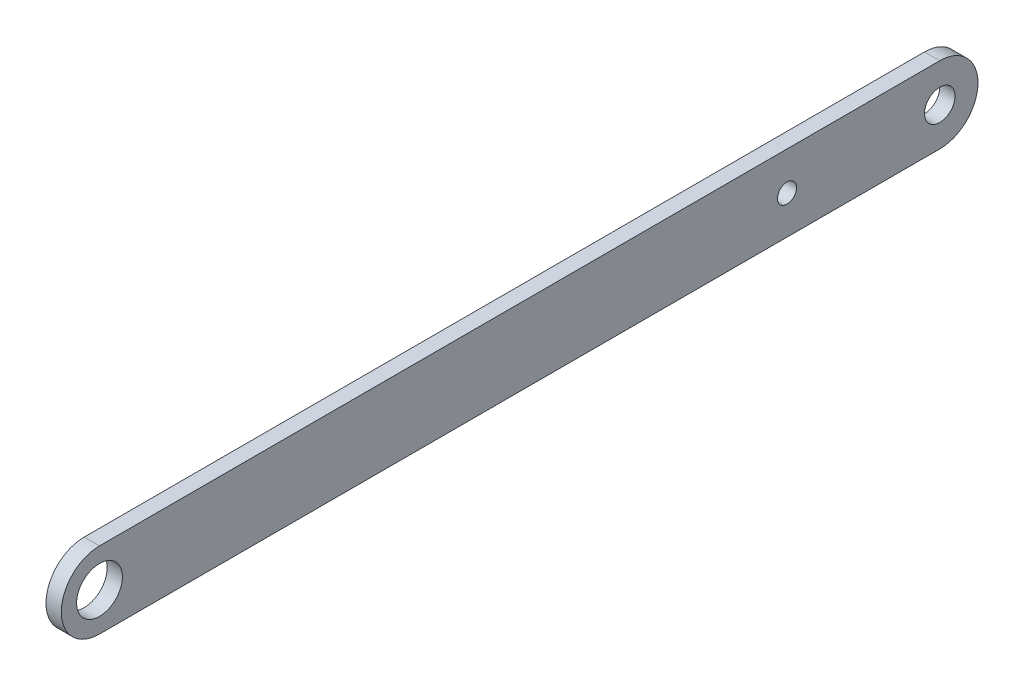
ISO-10303-21;
HEADER;
FILE_DESCRIPTION(('STEP AP214'),'2;1');
FILE_NAME('part.step','',(''),(''),'','','');
FILE_SCHEMA(('AUTOMOTIVE_DESIGN { 1 0 10303 214 1 1 1 1 }'));
ENDSEC;
DATA;
#1=APPLICATION_CONTEXT('core data for automotive mechanical design processes');
#2=APPLICATION_PROTOCOL_DEFINITION('international standard','automotive_design',2000,#1);
#3=PRODUCT_CONTEXT('',#1,'mechanical');
#4=PRODUCT('Part','Part','',(#3));
#5=PRODUCT_RELATED_PRODUCT_CATEGORY('part','',(#4));
#6=PRODUCT_DEFINITION_FORMATION('','',#4);
#7=PRODUCT_DEFINITION_CONTEXT('part definition',#1,'design');
#8=PRODUCT_DEFINITION('design','',#6,#7);
#9=PRODUCT_DEFINITION_SHAPE('','',#8);
#10=(LENGTH_UNIT() NAMED_UNIT(*) SI_UNIT(.MILLI.,.METRE.));
#11=(NAMED_UNIT(*) PLANE_ANGLE_UNIT() SI_UNIT($,.RADIAN.));
#12=(NAMED_UNIT(*) SI_UNIT($,.STERADIAN.) SOLID_ANGLE_UNIT());
#13=UNCERTAINTY_MEASURE_WITH_UNIT(LENGTH_MEASURE(1.E-05),#10,'distance_accuracy_value','');
#14=(GEOMETRIC_REPRESENTATION_CONTEXT(3) GLOBAL_UNCERTAINTY_ASSIGNED_CONTEXT((#13)) GLOBAL_UNIT_ASSIGNED_CONTEXT((#10,
#11,#12)) REPRESENTATION_CONTEXT('',''));
#15=CARTESIAN_POINT('',(0.,0.,0.));
#16=DIRECTION('',(0.,0.,1.));
#17=DIRECTION('',(1.,0.,0.));
#18=AXIS2_PLACEMENT_3D('',#15,#16,#17);
#19=CARTESIAN_POINT('',(2.,4.99999999999999,0.));
#20=DIRECTION('',(1.,0.,0.));
#21=DIRECTION('',(0.,0.,-1.));
#22=AXIS2_PLACEMENT_3D('',#19,#20,#21);
#23=PLANE('',#22);
#24=CARTESIAN_POINT('',(2.,4.99999999999999,0.));
#25=DIRECTION('',(1.,0.,0.));
#26=DIRECTION('',(0.,0.,-1.));
#27=AXIS2_PLACEMENT_3D('',#24,#25,#26);
#28=CIRCLE('',#27,3.);
#29=CARTESIAN_POINT('',(2.,4.99999999999999,-3.));
#30=VERTEX_POINT('',#29);
#31=EDGE_CURVE('E117',#30,#30,#28,.T.);
#32=ORIENTED_EDGE('',*,*,#31,.F.);
#33=EDGE_LOOP('',(#32));
#34=FACE_BOUND('',#33,.T.);
#35=CARTESIAN_POINT('',(2.,4.99999999999999,0.));
#36=DIRECTION('',(1.,0.,0.));
#37=DIRECTION('',(0.,0.,-1.));
#38=AXIS2_PLACEMENT_3D('',#35,#36,#37);
#39=CIRCLE('',#38,5.);
#40=CARTESIAN_POINT('',(2.,10.,0.));
#41=VERTEX_POINT('',#40);
#42=CARTESIAN_POINT('',(2.,0.,0.));
#43=VERTEX_POINT('',#42);
#44=EDGE_CURVE('E87',#41,#43,#39,.T.);
#45=ORIENTED_EDGE('',*,*,#44,.T.);
#46=DIRECTION('',(0.,0.,-1.));
#47=VECTOR('',#46,1.);
#48=CARTESIAN_POINT('',(2.,0.,0.));
#49=LINE('',#48,#47);
#50=CARTESIAN_POINT('',(2.,0.,-110.));
#51=VERTEX_POINT('',#50);
#52=EDGE_CURVE('E82',#43,#51,#49,.T.);
#53=ORIENTED_EDGE('',*,*,#52,.T.);
#54=CARTESIAN_POINT('',(2.,5.,-110.));
#55=DIRECTION('',(1.,0.,0.));
#56=DIRECTION('',(0.,0.,1.));
#57=AXIS2_PLACEMENT_3D('',#54,#55,#56);
#58=CIRCLE('',#57,5.);
#59=CARTESIAN_POINT('',(2.,10.,-110.));
#60=VERTEX_POINT('',#59);
#61=EDGE_CURVE('E85',#51,#60,#58,.T.);
#62=ORIENTED_EDGE('',*,*,#61,.T.);
#63=DIRECTION('',(0.,0.,1.));
#64=VECTOR('',#63,1.);
#65=CARTESIAN_POINT('',(2.,10.,0.));
#66=LINE('',#65,#64);
#67=EDGE_CURVE('E52',#60,#41,#66,.T.);
#68=ORIENTED_EDGE('',*,*,#67,.T.);
#69=EDGE_LOOP('',(#45,#53,#62,#68));
#70=FACE_BOUND('',#69,.T.);
#71=CARTESIAN_POINT('',(2.,5.,-110.));
#72=DIRECTION('',(1.,0.,0.));
#73=DIRECTION('',(0.,0.,-1.));
#74=AXIS2_PLACEMENT_3D('',#71,#72,#73);
#75=CIRCLE('',#74,2.);
#76=CARTESIAN_POINT('',(2.,5.,-112.));
#77=VERTEX_POINT('',#76);
#78=EDGE_CURVE('E102',#77,#77,#75,.T.);
#79=ORIENTED_EDGE('',*,*,#78,.F.);
#80=EDGE_LOOP('',(#79));
#81=FACE_BOUND('',#80,.T.);
#82=CARTESIAN_POINT('',(2.,5.,-90.));
#83=DIRECTION('',(1.,0.,0.));
#84=DIRECTION('',(0.,0.,-1.));
#85=AXIS2_PLACEMENT_3D('',#82,#83,#84);
#86=CIRCLE('',#85,1.25);
#87=CARTESIAN_POINT('',(2.,5.,-91.25));
#88=VERTEX_POINT('',#87);
#89=EDGE_CURVE('E123',#88,#88,#86,.T.);
#90=ORIENTED_EDGE('',*,*,#89,.F.);
#91=EDGE_LOOP('',(#90));
#92=FACE_BOUND('',#91,.T.);
#93=ADVANCED_FACE('F35',(#34,#70,#81,#92),#23,.T.);
#94=CARTESIAN_POINT('',(0.,4.99999999999999,0.));
#95=DIRECTION('',(1.,0.,0.));
#96=DIRECTION('',(0.,0.,-1.));
#97=AXIS2_PLACEMENT_3D('',#94,#95,#96);
#98=PLANE('',#97);
#99=CARTESIAN_POINT('',(0.,4.99999999999999,0.));
#100=DIRECTION('',(1.,0.,0.));
#101=DIRECTION('',(0.,0.,-1.));
#102=AXIS2_PLACEMENT_3D('',#99,#100,#101);
#103=CIRCLE('',#102,5.);
#104=CARTESIAN_POINT('',(0.,10.,0.));
#105=VERTEX_POINT('',#104);
#106=CARTESIAN_POINT('',(0.,0.,0.));
#107=VERTEX_POINT('',#106);
#108=EDGE_CURVE('E99',#105,#107,#103,.T.);
#109=ORIENTED_EDGE('',*,*,#108,.F.);
#110=DIRECTION('',(0.,0.,1.));
#111=VECTOR('',#110,1.);
#112=CARTESIAN_POINT('',(0.,10.,0.));
#113=LINE('',#112,#111);
#114=CARTESIAN_POINT('',(0.,10.,-110.));
#115=VERTEX_POINT('',#114);
#116=EDGE_CURVE('E75',#115,#105,#113,.T.);
#117=ORIENTED_EDGE('',*,*,#116,.F.);
#118=CARTESIAN_POINT('',(0.,5.,-110.));
#119=DIRECTION('',(1.,0.,0.));
#120=DIRECTION('',(0.,0.,1.));
#121=AXIS2_PLACEMENT_3D('',#118,#119,#120);
#122=CIRCLE('',#121,5.);
#123=CARTESIAN_POINT('',(0.,0.,-110.));
#124=VERTEX_POINT('',#123);
#125=EDGE_CURVE('E69',#124,#115,#122,.T.);
#126=ORIENTED_EDGE('',*,*,#125,.F.);
#127=DIRECTION('',(0.,0.,-1.));
#128=VECTOR('',#127,1.);
#129=CARTESIAN_POINT('',(0.,0.,0.));
#130=LINE('',#129,#128);
#131=EDGE_CURVE('E91',#107,#124,#130,.T.);
#132=ORIENTED_EDGE('',*,*,#131,.F.);
#133=EDGE_LOOP('',(#109,#117,#126,#132));
#134=FACE_BOUND('',#133,.T.);
#135=CARTESIAN_POINT('',(0.,5.,-110.));
#136=DIRECTION('',(1.,0.,0.));
#137=DIRECTION('',(0.,0.,-1.));
#138=AXIS2_PLACEMENT_3D('',#135,#136,#137);
#139=CIRCLE('',#138,2.);
#140=CARTESIAN_POINT('',(0.,5.,-112.));
#141=VERTEX_POINT('',#140);
#142=EDGE_CURVE('E114',#141,#141,#139,.T.);
#143=ORIENTED_EDGE('',*,*,#142,.T.);
#144=EDGE_LOOP('',(#143));
#145=FACE_BOUND('',#144,.T.);
#146=CARTESIAN_POINT('',(0.,4.99999999999999,0.));
#147=DIRECTION('',(1.,0.,0.));
#148=DIRECTION('',(0.,0.,-1.));
#149=AXIS2_PLACEMENT_3D('',#146,#147,#148);
#150=CIRCLE('',#149,3.);
#151=CARTESIAN_POINT('',(0.,4.99999999999999,-3.));
#152=VERTEX_POINT('',#151);
#153=EDGE_CURVE('E120',#152,#152,#150,.T.);
#154=ORIENTED_EDGE('',*,*,#153,.T.);
#155=EDGE_LOOP('',(#154));
#156=FACE_BOUND('',#155,.T.);
#157=CARTESIAN_POINT('',(0.,5.,-90.));
#158=DIRECTION('',(1.,0.,0.));
#159=DIRECTION('',(0.,0.,-1.));
#160=AXIS2_PLACEMENT_3D('',#157,#158,#159);
#161=CIRCLE('',#160,1.25);
#162=CARTESIAN_POINT('',(0.,5.,-91.25));
#163=VERTEX_POINT('',#162);
#164=EDGE_CURVE('E126',#163,#163,#161,.T.);
#165=ORIENTED_EDGE('',*,*,#164,.T.);
#166=EDGE_LOOP('',(#165));
#167=FACE_BOUND('',#166,.T.);
#168=ADVANCED_FACE('F110',(#134,#145,#156,#167),#98,.F.);
#169=CARTESIAN_POINT('',(2.,4.99999999999999,0.));
#170=DIRECTION('',(-1.,0.,0.));
#171=DIRECTION('',(0.,0.,1.));
#172=AXIS2_PLACEMENT_3D('',#169,#170,#171);
#173=CYLINDRICAL_SURFACE('',#172,5.);
#174=ORIENTED_EDGE('',*,*,#108,.T.);
#175=DIRECTION('',(-1.,0.,0.));
#176=VECTOR('',#175,1.);
#177=CARTESIAN_POINT('',(2.,0.,0.));
#178=LINE('',#177,#176);
#179=EDGE_CURVE('E11',#43,#107,#178,.T.);
#180=ORIENTED_EDGE('',*,*,#179,.F.);
#181=ORIENTED_EDGE('',*,*,#44,.F.);
#182=DIRECTION('',(-1.,0.,0.));
#183=VECTOR('',#182,1.);
#184=CARTESIAN_POINT('',(2.,10.,0.));
#185=LINE('',#184,#183);
#186=EDGE_CURVE('E95',#41,#105,#185,.T.);
#187=ORIENTED_EDGE('',*,*,#186,.T.);
#188=EDGE_LOOP('',(#174,#180,#181,#187));
#189=FACE_BOUND('',#188,.T.);
#190=ADVANCED_FACE('F37',(#189),#173,.T.);
#191=CARTESIAN_POINT('',(2.,0.,0.));
#192=DIRECTION('',(0.,1.,0.));
#193=DIRECTION('',(0.,0.,1.));
#194=AXIS2_PLACEMENT_3D('',#191,#192,#193);
#195=PLANE('',#194);
#196=ORIENTED_EDGE('',*,*,#131,.T.);
#197=DIRECTION('',(-1.,0.,0.));
#198=VECTOR('',#197,1.);
#199=CARTESIAN_POINT('',(2.,0.,-110.));
#200=LINE('',#199,#198);
#201=EDGE_CURVE('E44',#51,#124,#200,.T.);
#202=ORIENTED_EDGE('',*,*,#201,.F.);
#203=ORIENTED_EDGE('',*,*,#52,.F.);
#204=ORIENTED_EDGE('',*,*,#179,.T.);
#205=EDGE_LOOP('',(#196,#202,#203,#204));
#206=FACE_BOUND('',#205,.T.);
#207=ADVANCED_FACE('F90',(#206),#195,.F.);
#208=CARTESIAN_POINT('',(2.,5.,-110.));
#209=DIRECTION('',(-1.,0.,0.));
#210=DIRECTION('',(0.,0.,1.));
#211=AXIS2_PLACEMENT_3D('',#208,#209,#210);
#212=CYLINDRICAL_SURFACE('',#211,5.);
#213=ORIENTED_EDGE('',*,*,#125,.T.);
#214=DIRECTION('',(-1.,0.,0.));
#215=VECTOR('',#214,1.);
#216=CARTESIAN_POINT('',(2.,10.,-110.));
#217=LINE('',#216,#215);
#218=EDGE_CURVE('E92',#60,#115,#217,.T.);
#219=ORIENTED_EDGE('',*,*,#218,.F.);
#220=ORIENTED_EDGE('',*,*,#61,.F.);
#221=ORIENTED_EDGE('',*,*,#201,.T.);
#222=EDGE_LOOP('',(#213,#219,#220,#221));
#223=FACE_BOUND('',#222,.T.);
#224=ADVANCED_FACE('F93',(#223),#212,.T.);
#225=CARTESIAN_POINT('',(2.,10.,0.));
#226=DIRECTION('',(0.,-1.,0.));
#227=DIRECTION('',(0.,0.,-1.));
#228=AXIS2_PLACEMENT_3D('',#225,#226,#227);
#229=PLANE('',#228);
#230=ORIENTED_EDGE('',*,*,#116,.T.);
#231=ORIENTED_EDGE('',*,*,#186,.F.);
#232=ORIENTED_EDGE('',*,*,#67,.F.);
#233=ORIENTED_EDGE('',*,*,#218,.T.);
#234=EDGE_LOOP('',(#230,#231,#232,#233));
#235=FACE_BOUND('',#234,.T.);
#236=ADVANCED_FACE('F107',(#235),#229,.F.);
#237=CARTESIAN_POINT('',(2.,5.,-110.));
#238=DIRECTION('',(-1.,0.,0.));
#239=DIRECTION('',(0.,0.,1.));
#240=AXIS2_PLACEMENT_3D('',#237,#238,#239);
#241=CYLINDRICAL_SURFACE('',#240,2.);
#242=ORIENTED_EDGE('',*,*,#78,.T.);
#243=EDGE_LOOP('',(#242));
#244=FACE_BOUND('',#243,.T.);
#245=ORIENTED_EDGE('',*,*,#142,.F.);
#246=EDGE_LOOP('',(#245));
#247=FACE_BOUND('',#246,.T.);
#248=ADVANCED_FACE('F144',(#244,#247),#241,.F.);
#249=CARTESIAN_POINT('',(2.,4.99999999999999,0.));
#250=DIRECTION('',(-1.,0.,0.));
#251=DIRECTION('',(0.,0.,1.));
#252=AXIS2_PLACEMENT_3D('',#249,#250,#251);
#253=CYLINDRICAL_SURFACE('',#252,3.);
#254=ORIENTED_EDGE('',*,*,#31,.T.);
#255=EDGE_LOOP('',(#254));
#256=FACE_BOUND('',#255,.T.);
#257=ORIENTED_EDGE('',*,*,#153,.F.);
#258=EDGE_LOOP('',(#257));
#259=FACE_BOUND('',#258,.T.);
#260=ADVANCED_FACE('F190',(#256,#259),#253,.F.);
#261=CARTESIAN_POINT('',(2.,5.,-90.));
#262=DIRECTION('',(-1.,0.,0.));
#263=DIRECTION('',(0.,0.,1.));
#264=AXIS2_PLACEMENT_3D('',#261,#262,#263);
#265=CYLINDRICAL_SURFACE('',#264,1.25);
#266=ORIENTED_EDGE('',*,*,#89,.T.);
#267=EDGE_LOOP('',(#266));
#268=FACE_BOUND('',#267,.T.);
#269=ORIENTED_EDGE('',*,*,#164,.F.);
#270=EDGE_LOOP('',(#269));
#271=FACE_BOUND('',#270,.T.);
#272=ADVANCED_FACE('F132',(#268,#271),#265,.F.);
#273=CLOSED_SHELL('',(#93,#168,#190,#207,#224,#236,#248,#260,#272));
#274=MANIFOLD_SOLID_BREP('B2',#273);
#275=ADVANCED_BREP_SHAPE_REPRESENTATION('',(#18,#274),#14);
#276=SHAPE_DEFINITION_REPRESENTATION(#9,#275);
ENDSEC;
END-ISO-10303-21;
